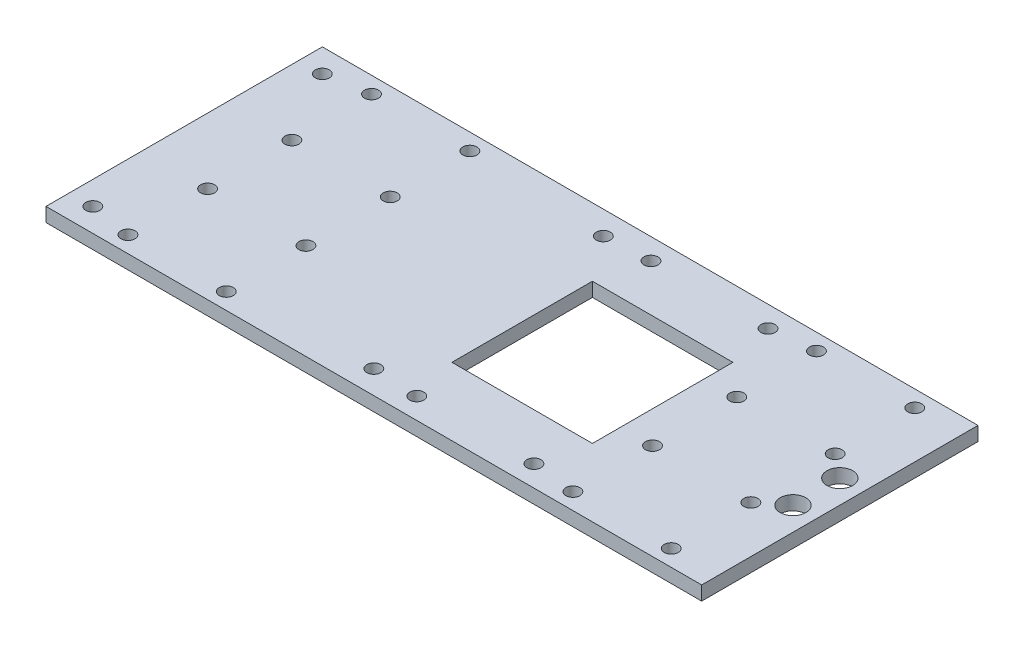
ISO-10303-21;
HEADER;
FILE_DESCRIPTION(('STEP AP214'),'2;1');
FILE_NAME('part.step','',(''),(''),'','','');
FILE_SCHEMA(('AUTOMOTIVE_DESIGN { 1 0 10303 214 1 1 1 1 }'));
ENDSEC;
DATA;
#1=APPLICATION_CONTEXT('core data for automotive mechanical design processes');
#2=APPLICATION_PROTOCOL_DEFINITION('international standard','automotive_design',2000,#1);
#3=PRODUCT_CONTEXT('',#1,'mechanical');
#4=PRODUCT('Part','Part','',(#3));
#5=PRODUCT_RELATED_PRODUCT_CATEGORY('part','',(#4));
#6=PRODUCT_DEFINITION_FORMATION('','',#4);
#7=PRODUCT_DEFINITION_CONTEXT('part definition',#1,'design');
#8=PRODUCT_DEFINITION('design','',#6,#7);
#9=PRODUCT_DEFINITION_SHAPE('','',#8);
#10=(LENGTH_UNIT() NAMED_UNIT(*) SI_UNIT(.MILLI.,.METRE.));
#11=(NAMED_UNIT(*) PLANE_ANGLE_UNIT() SI_UNIT($,.RADIAN.));
#12=(NAMED_UNIT(*) SI_UNIT($,.STERADIAN.) SOLID_ANGLE_UNIT());
#13=UNCERTAINTY_MEASURE_WITH_UNIT(LENGTH_MEASURE(1.E-05),#10,'distance_accuracy_value','');
#14=(GEOMETRIC_REPRESENTATION_CONTEXT(3) GLOBAL_UNCERTAINTY_ASSIGNED_CONTEXT((#13)) GLOBAL_UNIT_ASSIGNED_CONTEXT((#10,
#11,#12)) REPRESENTATION_CONTEXT('',''));
#15=CARTESIAN_POINT('',(0.,0.,0.));
#16=DIRECTION('',(0.,0.,1.));
#17=DIRECTION('',(1.,0.,0.));
#18=AXIS2_PLACEMENT_3D('',#15,#16,#17);
#19=CARTESIAN_POINT('',(0.,3.,0.));
#20=DIRECTION('',(0.,-1.,0.));
#21=DIRECTION('',(0.,0.,-1.));
#22=AXIS2_PLACEMENT_3D('',#19,#20,#21);
#23=PLANE('',#22);
#24=CARTESIAN_POINT('',(65.,3.,-5.));
#25=DIRECTION('',(0.,1.,0.));
#26=DIRECTION('',(0.,0.,1.));
#27=AXIS2_PLACEMENT_3D('',#24,#25,#26);
#28=CIRCLE('',#27,2.75000000000001);
#29=CARTESIAN_POINT('',(65.,3.,-2.24999999999999));
#30=VERTEX_POINT('',#29);
#31=EDGE_CURVE('E559',#30,#30,#28,.T.);
#32=ORIENTED_EDGE('',*,*,#31,.F.);
#33=EDGE_LOOP('',(#32));
#34=FACE_BOUND('',#33,.T.);
#35=CARTESIAN_POINT('',(65.,3.,5.));
#36=DIRECTION('',(0.,1.,0.));
#37=DIRECTION('',(0.,0.,1.));
#38=AXIS2_PLACEMENT_3D('',#35,#36,#37);
#39=CIRCLE('',#38,2.75000000000001);
#40=CARTESIAN_POINT('',(65.,3.,7.75000000000001));
#41=VERTEX_POINT('',#40);
#42=EDGE_CURVE('E561',#41,#41,#39,.T.);
#43=ORIENTED_EDGE('',*,*,#42,.F.);
#44=EDGE_LOOP('',(#43));
#45=FACE_BOUND('',#44,.T.);
#46=CARTESIAN_POINT('',(4.6713753918425,3.,-25.));
#47=DIRECTION('',(0.,1.,0.));
#48=DIRECTION('',(0.,0.,1.));
#49=AXIS2_PLACEMENT_3D('',#46,#47,#48);
#50=CIRCLE('',#49,1.5);
#51=CARTESIAN_POINT('',(4.6713753918425,3.,-23.5));
#52=VERTEX_POINT('',#51);
#53=EDGE_CURVE('E161',#52,#52,#50,.T.);
#54=ORIENTED_EDGE('',*,*,#53,.F.);
#55=EDGE_LOOP('',(#54));
#56=FACE_BOUND('',#55,.T.);
#57=CARTESIAN_POINT('',(4.6713753918425,3.,25.));
#58=DIRECTION('',(0.,1.,0.));
#59=DIRECTION('',(0.,0.,1.));
#60=AXIS2_PLACEMENT_3D('',#57,#58,#59);
#61=CIRCLE('',#60,1.5);
#62=CARTESIAN_POINT('',(4.6713753918425,3.,26.5));
#63=VERTEX_POINT('',#62);
#64=EDGE_CURVE('E169',#63,#63,#61,.T.);
#65=ORIENTED_EDGE('',*,*,#64,.F.);
#66=EDGE_LOOP('',(#65));
#67=FACE_BOUND('',#66,.T.);
#68=CARTESIAN_POINT('',(29.6713753918425,3.,25.));
#69=DIRECTION('',(0.,1.,0.));
#70=DIRECTION('',(0.,0.,1.));
#71=AXIS2_PLACEMENT_3D('',#68,#69,#70);
#72=CIRCLE('',#71,1.5);
#73=CARTESIAN_POINT('',(29.6713753918425,3.,26.5));
#74=VERTEX_POINT('',#73);
#75=EDGE_CURVE('E177',#74,#74,#72,.T.);
#76=ORIENTED_EDGE('',*,*,#75,.F.);
#77=EDGE_LOOP('',(#76));
#78=FACE_BOUND('',#77,.T.);
#79=CARTESIAN_POINT('',(29.6713753918425,3.,-25.));
#80=DIRECTION('',(0.,1.,0.));
#81=DIRECTION('',(0.,0.,1.));
#82=AXIS2_PLACEMENT_3D('',#79,#80,#81);
#83=CIRCLE('',#82,1.5);
#84=CARTESIAN_POINT('',(29.6713753918425,3.,-23.5));
#85=VERTEX_POINT('',#84);
#86=EDGE_CURVE('E185',#85,#85,#83,.T.);
#87=ORIENTED_EDGE('',*,*,#86,.F.);
#88=EDGE_LOOP('',(#87));
#89=FACE_BOUND('',#88,.T.);
#90=CARTESIAN_POINT('',(-65.,3.,24.5));
#91=DIRECTION('',(0.,1.,0.));
#92=DIRECTION('',(0.,0.,1.));
#93=AXIS2_PLACEMENT_3D('',#90,#91,#92);
#94=CIRCLE('',#93,1.5);
#95=CARTESIAN_POINT('',(-65.,3.,26.));
#96=VERTEX_POINT('',#95);
#97=EDGE_CURVE('E193',#96,#96,#94,.T.);
#98=ORIENTED_EDGE('',*,*,#97,.F.);
#99=EDGE_LOOP('',(#98));
#100=FACE_BOUND('',#99,.T.);
#101=CARTESIAN_POINT('',(-65.,3.,-24.5));
#102=DIRECTION('',(0.,1.,0.));
#103=DIRECTION('',(0.,0.,1.));
#104=AXIS2_PLACEMENT_3D('',#101,#102,#103);
#105=CIRCLE('',#104,1.5);
#106=CARTESIAN_POINT('',(-65.,3.,-23.));
#107=VERTEX_POINT('',#106);
#108=EDGE_CURVE('E201',#107,#107,#105,.T.);
#109=ORIENTED_EDGE('',*,*,#108,.F.);
#110=EDGE_LOOP('',(#109));
#111=FACE_BOUND('',#110,.T.);
#112=CARTESIAN_POINT('',(-5.,3.,-24.5));
#113=DIRECTION('',(0.,1.,0.));
#114=DIRECTION('',(0.,0.,1.));
#115=AXIS2_PLACEMENT_3D('',#112,#113,#114);
#116=CIRCLE('',#115,1.5);
#117=CARTESIAN_POINT('',(-5.,3.,-23.));
#118=VERTEX_POINT('',#117);
#119=EDGE_CURVE('E209',#118,#118,#116,.T.);
#120=ORIENTED_EDGE('',*,*,#119,.F.);
#121=EDGE_LOOP('',(#120));
#122=FACE_BOUND('',#121,.T.);
#123=CARTESIAN_POINT('',(-5.,3.,24.5));
#124=DIRECTION('',(0.,1.,0.));
#125=DIRECTION('',(0.,0.,1.));
#126=AXIS2_PLACEMENT_3D('',#123,#124,#125);
#127=CIRCLE('',#126,1.5);
#128=CARTESIAN_POINT('',(-5.,3.,26.));
#129=VERTEX_POINT('',#128);
#130=EDGE_CURVE('E217',#129,#129,#127,.T.);
#131=ORIENTED_EDGE('',*,*,#130,.F.);
#132=EDGE_LOOP('',(#131));
#133=FACE_BOUND('',#132,.T.);
#134=CARTESIAN_POINT('',(39.,3.,-9.));
#135=DIRECTION('',(0.,1.,0.));
#136=DIRECTION('',(0.,0.,1.));
#137=AXIS2_PLACEMENT_3D('',#134,#135,#136);
#138=CIRCLE('',#137,1.50000000000001);
#139=CARTESIAN_POINT('',(39.,3.,-7.49999999999999));
#140=VERTEX_POINT('',#139);
#141=EDGE_CURVE('E225',#140,#140,#138,.T.);
#142=ORIENTED_EDGE('',*,*,#141,.F.);
#143=EDGE_LOOP('',(#142));
#144=FACE_BOUND('',#143,.T.);
#145=CARTESIAN_POINT('',(60.,3.,-9.));
#146=DIRECTION('',(0.,1.,0.));
#147=DIRECTION('',(0.,0.,1.));
#148=AXIS2_PLACEMENT_3D('',#145,#146,#147);
#149=CIRCLE('',#148,1.5);
#150=CARTESIAN_POINT('',(60.,3.,-7.5));
#151=VERTEX_POINT('',#150);
#152=EDGE_CURVE('E233',#151,#151,#149,.T.);
#153=ORIENTED_EDGE('',*,*,#152,.F.);
#154=EDGE_LOOP('',(#153));
#155=FACE_BOUND('',#154,.T.);
#156=CARTESIAN_POINT('',(39.,3.,26.));
#157=DIRECTION('',(0.,1.,0.));
#158=DIRECTION('',(0.,0.,1.));
#159=AXIS2_PLACEMENT_3D('',#156,#157,#158);
#160=CIRCLE('',#159,1.5);
#161=CARTESIAN_POINT('',(39.,3.,27.5));
#162=VERTEX_POINT('',#161);
#163=EDGE_CURVE('E241',#162,#162,#160,.T.);
#164=ORIENTED_EDGE('',*,*,#163,.F.);
#165=EDGE_LOOP('',(#164));
#166=FACE_BOUND('',#165,.T.);
#167=CARTESIAN_POINT('',(60.,3.,26.));
#168=DIRECTION('',(0.,1.,0.));
#169=DIRECTION('',(0.,0.,1.));
#170=AXIS2_PLACEMENT_3D('',#167,#168,#169);
#171=CIRCLE('',#170,1.5);
#172=CARTESIAN_POINT('',(60.,3.,27.5));
#173=VERTEX_POINT('',#172);
#174=EDGE_CURVE('E249',#173,#173,#171,.T.);
#175=ORIENTED_EDGE('',*,*,#174,.F.);
#176=EDGE_LOOP('',(#175));
#177=FACE_BOUND('',#176,.T.);
#178=CARTESIAN_POINT('',(60.,3.,9.));
#179=DIRECTION('',(0.,1.,0.));
#180=DIRECTION('',(0.,0.,1.));
#181=AXIS2_PLACEMENT_3D('',#178,#179,#180);
#182=CIRCLE('',#181,1.5);
#183=CARTESIAN_POINT('',(60.,3.,10.5));
#184=VERTEX_POINT('',#183);
#185=EDGE_CURVE('E257',#184,#184,#182,.T.);
#186=ORIENTED_EDGE('',*,*,#185,.F.);
#187=EDGE_LOOP('',(#186));
#188=FACE_BOUND('',#187,.T.);
#189=CARTESIAN_POINT('',(39.,3.,9.));
#190=DIRECTION('',(0.,1.,0.));
#191=DIRECTION('',(0.,0.,1.));
#192=AXIS2_PLACEMENT_3D('',#189,#190,#191);
#193=CIRCLE('',#192,1.50000000000001);
#194=CARTESIAN_POINT('',(39.,3.,10.5));
#195=VERTEX_POINT('',#194);
#196=EDGE_CURVE('E265',#195,#195,#193,.T.);
#197=ORIENTED_EDGE('',*,*,#196,.F.);
#198=EDGE_LOOP('',(#197));
#199=FACE_BOUND('',#198,.T.);
#200=CARTESIAN_POINT('',(39.,3.,-26.));
#201=DIRECTION('',(0.,1.,0.));
#202=DIRECTION('',(0.,0.,1.));
#203=AXIS2_PLACEMENT_3D('',#200,#201,#202);
#204=CIRCLE('',#203,1.5);
#205=CARTESIAN_POINT('',(39.,3.,-24.5));
#206=VERTEX_POINT('',#205);
#207=EDGE_CURVE('E273',#206,#206,#204,.T.);
#208=ORIENTED_EDGE('',*,*,#207,.F.);
#209=EDGE_LOOP('',(#208));
#210=FACE_BOUND('',#209,.T.);
#211=CARTESIAN_POINT('',(60.,3.,-26.));
#212=DIRECTION('',(0.,1.,0.));
#213=DIRECTION('',(0.,0.,1.));
#214=AXIS2_PLACEMENT_3D('',#211,#212,#213);
#215=CIRCLE('',#214,1.5);
#216=CARTESIAN_POINT('',(60.,3.,-24.5));
#217=VERTEX_POINT('',#216);
#218=EDGE_CURVE('E281',#217,#217,#215,.T.);
#219=ORIENTED_EDGE('',*,*,#218,.F.);
#220=EDGE_LOOP('',(#219));
#221=FACE_BOUND('',#220,.T.);
#222=CARTESIAN_POINT('',(-56.,3.,26.));
#223=DIRECTION('',(0.,1.,0.));
#224=DIRECTION('',(0.,0.,1.));
#225=AXIS2_PLACEMENT_3D('',#222,#223,#224);
#226=CIRCLE('',#225,1.5);
#227=CARTESIAN_POINT('',(-56.,3.,27.5));
#228=VERTEX_POINT('',#227);
#229=EDGE_CURVE('E289',#228,#228,#226,.T.);
#230=ORIENTED_EDGE('',*,*,#229,.F.);
#231=EDGE_LOOP('',(#230));
#232=FACE_BOUND('',#231,.T.);
#233=CARTESIAN_POINT('',(-35.,3.,26.));
#234=DIRECTION('',(0.,1.,0.));
#235=DIRECTION('',(0.,0.,1.));
#236=AXIS2_PLACEMENT_3D('',#233,#234,#235);
#237=CIRCLE('',#236,1.5);
#238=CARTESIAN_POINT('',(-35.,3.,27.5));
#239=VERTEX_POINT('',#238);
#240=EDGE_CURVE('E297',#239,#239,#237,.T.);
#241=ORIENTED_EDGE('',*,*,#240,.F.);
#242=EDGE_LOOP('',(#241));
#243=FACE_BOUND('',#242,.T.);
#244=CARTESIAN_POINT('',(-56.,3.,9.00000000000001));
#245=DIRECTION('',(0.,1.,0.));
#246=DIRECTION('',(0.,0.,1.));
#247=AXIS2_PLACEMENT_3D('',#244,#245,#246);
#248=CIRCLE('',#247,1.5);
#249=CARTESIAN_POINT('',(-56.,3.,10.5));
#250=VERTEX_POINT('',#249);
#251=EDGE_CURVE('E305',#250,#250,#248,.T.);
#252=ORIENTED_EDGE('',*,*,#251,.F.);
#253=EDGE_LOOP('',(#252));
#254=FACE_BOUND('',#253,.T.);
#255=CARTESIAN_POINT('',(-35.,3.,9.00000000000001));
#256=DIRECTION('',(0.,1.,0.));
#257=DIRECTION('',(0.,0.,1.));
#258=AXIS2_PLACEMENT_3D('',#255,#256,#257);
#259=CIRCLE('',#258,1.5);
#260=CARTESIAN_POINT('',(-35.,3.,10.5));
#261=VERTEX_POINT('',#260);
#262=EDGE_CURVE('E313',#261,#261,#259,.T.);
#263=ORIENTED_EDGE('',*,*,#262,.F.);
#264=EDGE_LOOP('',(#263));
#265=FACE_BOUND('',#264,.T.);
#266=CARTESIAN_POINT('',(-35.,3.,-9.00000000000001));
#267=DIRECTION('',(0.,1.,0.));
#268=DIRECTION('',(0.,0.,1.));
#269=AXIS2_PLACEMENT_3D('',#266,#267,#268);
#270=CIRCLE('',#269,1.5);
#271=CARTESIAN_POINT('',(-35.,3.,-7.50000000000001));
#272=VERTEX_POINT('',#271);
#273=EDGE_CURVE('E321',#272,#272,#270,.T.);
#274=ORIENTED_EDGE('',*,*,#273,.F.);
#275=EDGE_LOOP('',(#274));
#276=FACE_BOUND('',#275,.T.);
#277=CARTESIAN_POINT('',(-56.,3.,-8.99999999999999));
#278=DIRECTION('',(0.,1.,0.));
#279=DIRECTION('',(0.,0.,1.));
#280=AXIS2_PLACEMENT_3D('',#277,#278,#279);
#281=CIRCLE('',#280,1.5);
#282=CARTESIAN_POINT('',(-56.,3.,-7.49999999999999));
#283=VERTEX_POINT('',#282);
#284=EDGE_CURVE('E329',#283,#283,#281,.T.);
#285=ORIENTED_EDGE('',*,*,#284,.F.);
#286=EDGE_LOOP('',(#285));
#287=FACE_BOUND('',#286,.T.);
#288=CARTESIAN_POINT('',(-56.,3.,-26.));
#289=DIRECTION('',(0.,1.,0.));
#290=DIRECTION('',(0.,0.,1.));
#291=AXIS2_PLACEMENT_3D('',#288,#289,#290);
#292=CIRCLE('',#291,1.5);
#293=CARTESIAN_POINT('',(-56.,3.,-24.5));
#294=VERTEX_POINT('',#293);
#295=EDGE_CURVE('E337',#294,#294,#292,.T.);
#296=ORIENTED_EDGE('',*,*,#295,.F.);
#297=EDGE_LOOP('',(#296));
#298=FACE_BOUND('',#297,.T.);
#299=CARTESIAN_POINT('',(-35.,3.,-26.));
#300=DIRECTION('',(0.,1.,0.));
#301=DIRECTION('',(0.,0.,1.));
#302=AXIS2_PLACEMENT_3D('',#299,#300,#301);
#303=CIRCLE('',#302,1.5);
#304=CARTESIAN_POINT('',(-35.,3.,-24.5));
#305=VERTEX_POINT('',#304);
#306=EDGE_CURVE('E345',#305,#305,#303,.T.);
#307=ORIENTED_EDGE('',*,*,#306,.F.);
#308=EDGE_LOOP('',(#307));
#309=FACE_BOUND('',#308,.T.);
#310=DIRECTION('',(0.,0.,-1.));
#311=VECTOR('',#310,1.);
#312=CARTESIAN_POINT('',(70.,3.,29.5));
#313=LINE('',#312,#311);
#314=CARTESIAN_POINT('',(70.,3.,29.5));
#315=VERTEX_POINT('',#314);
#316=CARTESIAN_POINT('',(70.,3.,-29.5));
#317=VERTEX_POINT('',#316);
#318=EDGE_CURVE('E353',#315,#317,#313,.T.);
#319=ORIENTED_EDGE('',*,*,#318,.T.);
#320=DIRECTION('',(-1.,0.,0.));
#321=VECTOR('',#320,1.);
#322=CARTESIAN_POINT('',(-70.,3.,-29.5));
#323=LINE('',#322,#321);
#324=CARTESIAN_POINT('',(-70.,3.,-29.5));
#325=VERTEX_POINT('',#324);
#326=EDGE_CURVE('E357',#317,#325,#323,.T.);
#327=ORIENTED_EDGE('',*,*,#326,.T.);
#328=DIRECTION('',(0.,0.,1.));
#329=VECTOR('',#328,1.);
#330=CARTESIAN_POINT('',(-70.,3.,29.5));
#331=LINE('',#330,#329);
#332=CARTESIAN_POINT('',(-70.,3.,29.5));
#333=VERTEX_POINT('',#332);
#334=EDGE_CURVE('E361',#325,#333,#331,.T.);
#335=ORIENTED_EDGE('',*,*,#334,.T.);
#336=DIRECTION('',(1.,0.,0.));
#337=VECTOR('',#336,1.);
#338=CARTESIAN_POINT('',(-70.,3.,29.5));
#339=LINE('',#338,#337);
#340=EDGE_CURVE('E364',#333,#315,#339,.T.);
#341=ORIENTED_EDGE('',*,*,#340,.T.);
#342=EDGE_LOOP('',(#319,#327,#335,#341));
#343=FACE_BOUND('',#342,.T.);
#344=DIRECTION('',(0.,0.,-1.));
#345=VECTOR('',#344,1.);
#346=CARTESIAN_POINT('',(32.1713753918425,3.,15.));
#347=LINE('',#346,#345);
#348=CARTESIAN_POINT('',(32.1713753918425,3.,15.));
#349=VERTEX_POINT('',#348);
#350=CARTESIAN_POINT('',(32.1713753918425,3.,-15.));
#351=VERTEX_POINT('',#350);
#352=EDGE_CURVE('E111',#349,#351,#347,.T.);
#353=ORIENTED_EDGE('',*,*,#352,.F.);
#354=DIRECTION('',(1.,0.,0.));
#355=VECTOR('',#354,1.);
#356=CARTESIAN_POINT('',(2.1713753918425,3.,15.));
#357=LINE('',#356,#355);
#358=CARTESIAN_POINT('',(2.1713753918425,3.,15.));
#359=VERTEX_POINT('',#358);
#360=EDGE_CURVE('E137',#359,#349,#357,.T.);
#361=ORIENTED_EDGE('',*,*,#360,.F.);
#362=DIRECTION('',(0.,0.,1.));
#363=VECTOR('',#362,1.);
#364=CARTESIAN_POINT('',(2.1713753918425,3.,15.));
#365=LINE('',#364,#363);
#366=CARTESIAN_POINT('',(2.1713753918425,3.,-15.));
#367=VERTEX_POINT('',#366);
#368=EDGE_CURVE('E133',#367,#359,#365,.T.);
#369=ORIENTED_EDGE('',*,*,#368,.F.);
#370=DIRECTION('',(-1.,0.,0.));
#371=VECTOR('',#370,1.);
#372=CARTESIAN_POINT('',(2.1713753918425,3.,-15.));
#373=LINE('',#372,#371);
#374=EDGE_CURVE('E120',#351,#367,#373,.T.);
#375=ORIENTED_EDGE('',*,*,#374,.F.);
#376=EDGE_LOOP('',(#353,#361,#369,#375));
#377=FACE_BOUND('',#376,.T.);
#378=ADVANCED_FACE('F45',(#34,#45,#56,#67,#78,#89,#100,#111,#122,#133,#144,#155,#166,#177,#188,
#199,#210,#221,#232,#243,#254,#265,#276,#287,#298,#309,#343,#377),#23,.F.);
#379=CARTESIAN_POINT('',(0.,0.,0.));
#380=DIRECTION('',(0.,-1.,0.));
#381=DIRECTION('',(0.,0.,-1.));
#382=AXIS2_PLACEMENT_3D('',#379,#380,#381);
#383=PLANE('',#382);
#384=CARTESIAN_POINT('',(65.,0.,-5.));
#385=DIRECTION('',(0.,1.,0.));
#386=DIRECTION('',(0.,0.,1.));
#387=AXIS2_PLACEMENT_3D('',#384,#385,#386);
#388=CIRCLE('',#387,2.75000000000001);
#389=CARTESIAN_POINT('',(65.,0.,-2.24999999999999));
#390=VERTEX_POINT('',#389);
#391=EDGE_CURVE('E145',#390,#390,#388,.T.);
#392=ORIENTED_EDGE('',*,*,#391,.T.);
#393=EDGE_LOOP('',(#392));
#394=FACE_BOUND('',#393,.T.);
#395=CARTESIAN_POINT('',(65.,0.,5.));
#396=DIRECTION('',(0.,1.,0.));
#397=DIRECTION('',(0.,0.,1.));
#398=AXIS2_PLACEMENT_3D('',#395,#396,#397);
#399=CIRCLE('',#398,2.75000000000001);
#400=CARTESIAN_POINT('',(65.,0.,7.75000000000001));
#401=VERTEX_POINT('',#400);
#402=EDGE_CURVE('E567',#401,#401,#399,.T.);
#403=ORIENTED_EDGE('',*,*,#402,.T.);
#404=EDGE_LOOP('',(#403));
#405=FACE_BOUND('',#404,.T.);
#406=CARTESIAN_POINT('',(4.6713753918425,0.,25.));
#407=DIRECTION('',(0.,1.,0.));
#408=DIRECTION('',(0.,0.,1.));
#409=AXIS2_PLACEMENT_3D('',#406,#407,#408);
#410=CIRCLE('',#409,1.5);
#411=CARTESIAN_POINT('',(4.6713753918425,0.,26.5));
#412=VERTEX_POINT('',#411);
#413=EDGE_CURVE('E165',#412,#412,#410,.T.);
#414=ORIENTED_EDGE('',*,*,#413,.T.);
#415=EDGE_LOOP('',(#414));
#416=FACE_BOUND('',#415,.T.);
#417=CARTESIAN_POINT('',(29.6713753918425,0.,-25.));
#418=DIRECTION('',(0.,1.,0.));
#419=DIRECTION('',(0.,0.,1.));
#420=AXIS2_PLACEMENT_3D('',#417,#418,#419);
#421=CIRCLE('',#420,1.5);
#422=CARTESIAN_POINT('',(29.6713753918425,0.,-23.5));
#423=VERTEX_POINT('',#422);
#424=EDGE_CURVE('E181',#423,#423,#421,.T.);
#425=ORIENTED_EDGE('',*,*,#424,.T.);
#426=EDGE_LOOP('',(#425));
#427=FACE_BOUND('',#426,.T.);
#428=CARTESIAN_POINT('',(-65.,0.,-24.5));
#429=DIRECTION('',(0.,1.,0.));
#430=DIRECTION('',(0.,0.,1.));
#431=AXIS2_PLACEMENT_3D('',#428,#429,#430);
#432=CIRCLE('',#431,1.5);
#433=CARTESIAN_POINT('',(-65.,0.,-23.));
#434=VERTEX_POINT('',#433);
#435=EDGE_CURVE('E197',#434,#434,#432,.T.);
#436=ORIENTED_EDGE('',*,*,#435,.T.);
#437=EDGE_LOOP('',(#436));
#438=FACE_BOUND('',#437,.T.);
#439=CARTESIAN_POINT('',(-5.,0.,24.5));
#440=DIRECTION('',(0.,1.,0.));
#441=DIRECTION('',(0.,0.,1.));
#442=AXIS2_PLACEMENT_3D('',#439,#440,#441);
#443=CIRCLE('',#442,1.5);
#444=CARTESIAN_POINT('',(-5.,0.,26.));
#445=VERTEX_POINT('',#444);
#446=EDGE_CURVE('E213',#445,#445,#443,.T.);
#447=ORIENTED_EDGE('',*,*,#446,.T.);
#448=EDGE_LOOP('',(#447));
#449=FACE_BOUND('',#448,.T.);
#450=CARTESIAN_POINT('',(60.,0.,-9.));
#451=DIRECTION('',(0.,1.,0.));
#452=DIRECTION('',(0.,0.,1.));
#453=AXIS2_PLACEMENT_3D('',#450,#451,#452);
#454=CIRCLE('',#453,1.5);
#455=CARTESIAN_POINT('',(60.,0.,-7.5));
#456=VERTEX_POINT('',#455);
#457=EDGE_CURVE('E229',#456,#456,#454,.T.);
#458=ORIENTED_EDGE('',*,*,#457,.T.);
#459=EDGE_LOOP('',(#458));
#460=FACE_BOUND('',#459,.T.);
#461=CARTESIAN_POINT('',(60.,0.,26.));
#462=DIRECTION('',(0.,1.,0.));
#463=DIRECTION('',(0.,0.,1.));
#464=AXIS2_PLACEMENT_3D('',#461,#462,#463);
#465=CIRCLE('',#464,1.5);
#466=CARTESIAN_POINT('',(60.,0.,27.5));
#467=VERTEX_POINT('',#466);
#468=EDGE_CURVE('E245',#467,#467,#465,.T.);
#469=ORIENTED_EDGE('',*,*,#468,.T.);
#470=EDGE_LOOP('',(#469));
#471=FACE_BOUND('',#470,.T.);
#472=CARTESIAN_POINT('',(39.,0.,9.));
#473=DIRECTION('',(0.,1.,0.));
#474=DIRECTION('',(0.,0.,1.));
#475=AXIS2_PLACEMENT_3D('',#472,#473,#474);
#476=CIRCLE('',#475,1.50000000000001);
#477=CARTESIAN_POINT('',(39.,0.,10.5));
#478=VERTEX_POINT('',#477);
#479=EDGE_CURVE('E261',#478,#478,#476,.T.);
#480=ORIENTED_EDGE('',*,*,#479,.T.);
#481=EDGE_LOOP('',(#480));
#482=FACE_BOUND('',#481,.T.);
#483=CARTESIAN_POINT('',(60.,0.,-26.));
#484=DIRECTION('',(0.,1.,0.));
#485=DIRECTION('',(0.,0.,1.));
#486=AXIS2_PLACEMENT_3D('',#483,#484,#485);
#487=CIRCLE('',#486,1.5);
#488=CARTESIAN_POINT('',(60.,0.,-24.5));
#489=VERTEX_POINT('',#488);
#490=EDGE_CURVE('E277',#489,#489,#487,.T.);
#491=ORIENTED_EDGE('',*,*,#490,.T.);
#492=EDGE_LOOP('',(#491));
#493=FACE_BOUND('',#492,.T.);
#494=CARTESIAN_POINT('',(-35.,0.,26.));
#495=DIRECTION('',(0.,1.,0.));
#496=DIRECTION('',(0.,0.,1.));
#497=AXIS2_PLACEMENT_3D('',#494,#495,#496);
#498=CIRCLE('',#497,1.5);
#499=CARTESIAN_POINT('',(-35.,0.,27.5));
#500=VERTEX_POINT('',#499);
#501=EDGE_CURVE('E293',#500,#500,#498,.T.);
#502=ORIENTED_EDGE('',*,*,#501,.T.);
#503=EDGE_LOOP('',(#502));
#504=FACE_BOUND('',#503,.T.);
#505=CARTESIAN_POINT('',(-35.,0.,9.00000000000001));
#506=DIRECTION('',(0.,1.,0.));
#507=DIRECTION('',(0.,0.,1.));
#508=AXIS2_PLACEMENT_3D('',#505,#506,#507);
#509=CIRCLE('',#508,1.5);
#510=CARTESIAN_POINT('',(-35.,0.,10.5));
#511=VERTEX_POINT('',#510);
#512=EDGE_CURVE('E309',#511,#511,#509,.T.);
#513=ORIENTED_EDGE('',*,*,#512,.T.);
#514=EDGE_LOOP('',(#513));
#515=FACE_BOUND('',#514,.T.);
#516=CARTESIAN_POINT('',(-56.,0.,-8.99999999999999));
#517=DIRECTION('',(0.,1.,0.));
#518=DIRECTION('',(0.,0.,1.));
#519=AXIS2_PLACEMENT_3D('',#516,#517,#518);
#520=CIRCLE('',#519,1.5);
#521=CARTESIAN_POINT('',(-56.,0.,-7.49999999999999));
#522=VERTEX_POINT('',#521);
#523=EDGE_CURVE('E325',#522,#522,#520,.T.);
#524=ORIENTED_EDGE('',*,*,#523,.T.);
#525=EDGE_LOOP('',(#524));
#526=FACE_BOUND('',#525,.T.);
#527=CARTESIAN_POINT('',(-35.,0.,-26.));
#528=DIRECTION('',(0.,1.,0.));
#529=DIRECTION('',(0.,0.,1.));
#530=AXIS2_PLACEMENT_3D('',#527,#528,#529);
#531=CIRCLE('',#530,1.5);
#532=CARTESIAN_POINT('',(-35.,0.,-24.5));
#533=VERTEX_POINT('',#532);
#534=EDGE_CURVE('E341',#533,#533,#531,.T.);
#535=ORIENTED_EDGE('',*,*,#534,.T.);
#536=EDGE_LOOP('',(#535));
#537=FACE_BOUND('',#536,.T.);
#538=DIRECTION('',(0.,0.,-1.));
#539=VECTOR('',#538,1.);
#540=CARTESIAN_POINT('',(70.,0.,29.5));
#541=LINE('',#540,#539);
#542=CARTESIAN_POINT('',(70.,0.,29.5));
#543=VERTEX_POINT('',#542);
#544=CARTESIAN_POINT('',(70.,0.,-29.5));
#545=VERTEX_POINT('',#544);
#546=EDGE_CURVE('E349',#543,#545,#541,.T.);
#547=ORIENTED_EDGE('',*,*,#546,.F.);
#548=DIRECTION('',(1.,0.,0.));
#549=VECTOR('',#548,1.);
#550=CARTESIAN_POINT('',(-70.,0.,29.5));
#551=LINE('',#550,#549);
#552=CARTESIAN_POINT('',(-70.,0.,29.5));
#553=VERTEX_POINT('',#552);
#554=EDGE_CURVE('E358',#553,#543,#551,.T.);
#555=ORIENTED_EDGE('',*,*,#554,.F.);
#556=DIRECTION('',(0.,0.,1.));
#557=VECTOR('',#556,1.);
#558=CARTESIAN_POINT('',(-70.,0.,29.5));
#559=LINE('',#558,#557);
#560=CARTESIAN_POINT('',(-70.,0.,-29.5));
#561=VERTEX_POINT('',#560);
#562=EDGE_CURVE('E374',#561,#553,#559,.T.);
#563=ORIENTED_EDGE('',*,*,#562,.F.);
#564=DIRECTION('',(-1.,0.,0.));
#565=VECTOR('',#564,1.);
#566=CARTESIAN_POINT('',(-70.,0.,-29.5));
#567=LINE('',#566,#565);
#568=EDGE_CURVE('E371',#545,#561,#567,.T.);
#569=ORIENTED_EDGE('',*,*,#568,.F.);
#570=EDGE_LOOP('',(#547,#555,#563,#569));
#571=FACE_BOUND('',#570,.T.);
#572=CARTESIAN_POINT('',(-56.,0.,-26.));
#573=DIRECTION('',(0.,1.,0.));
#574=DIRECTION('',(0.,0.,1.));
#575=AXIS2_PLACEMENT_3D('',#572,#573,#574);
#576=CIRCLE('',#575,1.5);
#577=CARTESIAN_POINT('',(-56.,0.,-24.5));
#578=VERTEX_POINT('',#577);
#579=EDGE_CURVE('E333',#578,#578,#576,.T.);
#580=ORIENTED_EDGE('',*,*,#579,.T.);
#581=EDGE_LOOP('',(#580));
#582=FACE_BOUND('',#581,.T.);
#583=CARTESIAN_POINT('',(-35.,0.,-9.00000000000001));
#584=DIRECTION('',(0.,1.,0.));
#585=DIRECTION('',(0.,0.,1.));
#586=AXIS2_PLACEMENT_3D('',#583,#584,#585);
#587=CIRCLE('',#586,1.5);
#588=CARTESIAN_POINT('',(-35.,0.,-7.50000000000001));
#589=VERTEX_POINT('',#588);
#590=EDGE_CURVE('E317',#589,#589,#587,.T.);
#591=ORIENTED_EDGE('',*,*,#590,.T.);
#592=EDGE_LOOP('',(#591));
#593=FACE_BOUND('',#592,.T.);
#594=CARTESIAN_POINT('',(-56.,0.,9.00000000000001));
#595=DIRECTION('',(0.,1.,0.));
#596=DIRECTION('',(0.,0.,1.));
#597=AXIS2_PLACEMENT_3D('',#594,#595,#596);
#598=CIRCLE('',#597,1.5);
#599=CARTESIAN_POINT('',(-56.,0.,10.5));
#600=VERTEX_POINT('',#599);
#601=EDGE_CURVE('E301',#600,#600,#598,.T.);
#602=ORIENTED_EDGE('',*,*,#601,.T.);
#603=EDGE_LOOP('',(#602));
#604=FACE_BOUND('',#603,.T.);
#605=CARTESIAN_POINT('',(-56.,0.,26.));
#606=DIRECTION('',(0.,1.,0.));
#607=DIRECTION('',(0.,0.,1.));
#608=AXIS2_PLACEMENT_3D('',#605,#606,#607);
#609=CIRCLE('',#608,1.5);
#610=CARTESIAN_POINT('',(-56.,0.,27.5));
#611=VERTEX_POINT('',#610);
#612=EDGE_CURVE('E285',#611,#611,#609,.T.);
#613=ORIENTED_EDGE('',*,*,#612,.T.);
#614=EDGE_LOOP('',(#613));
#615=FACE_BOUND('',#614,.T.);
#616=CARTESIAN_POINT('',(39.,0.,-26.));
#617=DIRECTION('',(0.,1.,0.));
#618=DIRECTION('',(0.,0.,1.));
#619=AXIS2_PLACEMENT_3D('',#616,#617,#618);
#620=CIRCLE('',#619,1.5);
#621=CARTESIAN_POINT('',(39.,0.,-24.5));
#622=VERTEX_POINT('',#621);
#623=EDGE_CURVE('E269',#622,#622,#620,.T.);
#624=ORIENTED_EDGE('',*,*,#623,.T.);
#625=EDGE_LOOP('',(#624));
#626=FACE_BOUND('',#625,.T.);
#627=CARTESIAN_POINT('',(60.,0.,9.));
#628=DIRECTION('',(0.,1.,0.));
#629=DIRECTION('',(0.,0.,1.));
#630=AXIS2_PLACEMENT_3D('',#627,#628,#629);
#631=CIRCLE('',#630,1.5);
#632=CARTESIAN_POINT('',(60.,0.,10.5));
#633=VERTEX_POINT('',#632);
#634=EDGE_CURVE('E253',#633,#633,#631,.T.);
#635=ORIENTED_EDGE('',*,*,#634,.T.);
#636=EDGE_LOOP('',(#635));
#637=FACE_BOUND('',#636,.T.);
#638=CARTESIAN_POINT('',(39.,0.,26.));
#639=DIRECTION('',(0.,1.,0.));
#640=DIRECTION('',(0.,0.,1.));
#641=AXIS2_PLACEMENT_3D('',#638,#639,#640);
#642=CIRCLE('',#641,1.5);
#643=CARTESIAN_POINT('',(39.,0.,27.5));
#644=VERTEX_POINT('',#643);
#645=EDGE_CURVE('E237',#644,#644,#642,.T.);
#646=ORIENTED_EDGE('',*,*,#645,.T.);
#647=EDGE_LOOP('',(#646));
#648=FACE_BOUND('',#647,.T.);
#649=CARTESIAN_POINT('',(39.,0.,-9.));
#650=DIRECTION('',(0.,1.,0.));
#651=DIRECTION('',(0.,0.,1.));
#652=AXIS2_PLACEMENT_3D('',#649,#650,#651);
#653=CIRCLE('',#652,1.50000000000001);
#654=CARTESIAN_POINT('',(39.,0.,-7.49999999999999));
#655=VERTEX_POINT('',#654);
#656=EDGE_CURVE('E221',#655,#655,#653,.T.);
#657=ORIENTED_EDGE('',*,*,#656,.T.);
#658=EDGE_LOOP('',(#657));
#659=FACE_BOUND('',#658,.T.);
#660=CARTESIAN_POINT('',(-5.,0.,-24.5));
#661=DIRECTION('',(0.,1.,0.));
#662=DIRECTION('',(0.,0.,1.));
#663=AXIS2_PLACEMENT_3D('',#660,#661,#662);
#664=CIRCLE('',#663,1.5);
#665=CARTESIAN_POINT('',(-5.,0.,-23.));
#666=VERTEX_POINT('',#665);
#667=EDGE_CURVE('E205',#666,#666,#664,.T.);
#668=ORIENTED_EDGE('',*,*,#667,.T.);
#669=EDGE_LOOP('',(#668));
#670=FACE_BOUND('',#669,.T.);
#671=CARTESIAN_POINT('',(-65.,0.,24.5));
#672=DIRECTION('',(0.,1.,0.));
#673=DIRECTION('',(0.,0.,1.));
#674=AXIS2_PLACEMENT_3D('',#671,#672,#673);
#675=CIRCLE('',#674,1.5);
#676=CARTESIAN_POINT('',(-65.,0.,26.));
#677=VERTEX_POINT('',#676);
#678=EDGE_CURVE('E189',#677,#677,#675,.T.);
#679=ORIENTED_EDGE('',*,*,#678,.T.);
#680=EDGE_LOOP('',(#679));
#681=FACE_BOUND('',#680,.T.);
#682=CARTESIAN_POINT('',(29.6713753918425,0.,25.));
#683=DIRECTION('',(0.,1.,0.));
#684=DIRECTION('',(0.,0.,1.));
#685=AXIS2_PLACEMENT_3D('',#682,#683,#684);
#686=CIRCLE('',#685,1.5);
#687=CARTESIAN_POINT('',(29.6713753918425,0.,26.5));
#688=VERTEX_POINT('',#687);
#689=EDGE_CURVE('E173',#688,#688,#686,.T.);
#690=ORIENTED_EDGE('',*,*,#689,.T.);
#691=EDGE_LOOP('',(#690));
#692=FACE_BOUND('',#691,.T.);
#693=CARTESIAN_POINT('',(4.6713753918425,0.,-25.));
#694=DIRECTION('',(0.,1.,0.));
#695=DIRECTION('',(0.,0.,1.));
#696=AXIS2_PLACEMENT_3D('',#693,#694,#695);
#697=CIRCLE('',#696,1.5);
#698=CARTESIAN_POINT('',(4.6713753918425,0.,-23.5));
#699=VERTEX_POINT('',#698);
#700=EDGE_CURVE('E129',#699,#699,#697,.T.);
#701=ORIENTED_EDGE('',*,*,#700,.T.);
#702=EDGE_LOOP('',(#701));
#703=FACE_BOUND('',#702,.T.);
#704=DIRECTION('',(1.,0.,0.));
#705=VECTOR('',#704,1.);
#706=CARTESIAN_POINT('',(2.1713753918425,0.,15.));
#707=LINE('',#706,#705);
#708=CARTESIAN_POINT('',(2.1713753918425,0.,15.));
#709=VERTEX_POINT('',#708);
#710=CARTESIAN_POINT('',(32.1713753918425,0.,15.));
#711=VERTEX_POINT('',#710);
#712=EDGE_CURVE('E121',#709,#711,#707,.T.);
#713=ORIENTED_EDGE('',*,*,#712,.T.);
#714=DIRECTION('',(0.,0.,-1.));
#715=VECTOR('',#714,1.);
#716=CARTESIAN_POINT('',(32.1713753918425,0.,15.));
#717=LINE('',#716,#715);
#718=CARTESIAN_POINT('',(32.1713753918425,0.,-15.));
#719=VERTEX_POINT('',#718);
#720=EDGE_CURVE('E69',#711,#719,#717,.T.);
#721=ORIENTED_EDGE('',*,*,#720,.T.);
#722=DIRECTION('',(-1.,0.,0.));
#723=VECTOR('',#722,1.);
#724=CARTESIAN_POINT('',(2.1713753918425,0.,-15.));
#725=LINE('',#724,#723);
#726=CARTESIAN_POINT('',(2.1713753918425,0.,-15.));
#727=VERTEX_POINT('',#726);
#728=EDGE_CURVE('E127',#719,#727,#725,.T.);
#729=ORIENTED_EDGE('',*,*,#728,.T.);
#730=DIRECTION('',(0.,0.,1.));
#731=VECTOR('',#730,1.);
#732=CARTESIAN_POINT('',(2.1713753918425,0.,15.));
#733=LINE('',#732,#731);
#734=EDGE_CURVE('E148',#727,#709,#733,.T.);
#735=ORIENTED_EDGE('',*,*,#734,.T.);
#736=EDGE_LOOP('',(#713,#721,#729,#735));
#737=FACE_BOUND('',#736,.T.);
#738=ADVANCED_FACE('F397',(#394,#405,#416,#427,#438,#449,#460,#471,#482,#493,#504,#515,#526,
#537,#571,#582,#593,#604,#615,#626,#637,#648,#659,#670,#681,#692,#703,#737),#383,.T.);
#739=CARTESIAN_POINT('',(70.,3.,29.5));
#740=DIRECTION('',(-1.,0.,0.));
#741=DIRECTION('',(0.,0.,1.));
#742=AXIS2_PLACEMENT_3D('',#739,#740,#741);
#743=PLANE('',#742);
#744=ORIENTED_EDGE('',*,*,#546,.T.);
#745=DIRECTION('',(0.,-1.,0.));
#746=VECTOR('',#745,1.);
#747=CARTESIAN_POINT('',(70.,3.,-29.5));
#748=LINE('',#747,#746);
#749=EDGE_CURVE('E11',#317,#545,#748,.T.);
#750=ORIENTED_EDGE('',*,*,#749,.F.);
#751=ORIENTED_EDGE('',*,*,#318,.F.);
#752=DIRECTION('',(0.,-1.,0.));
#753=VECTOR('',#752,1.);
#754=CARTESIAN_POINT('',(70.,3.,29.5));
#755=LINE('',#754,#753);
#756=EDGE_CURVE('E367',#315,#543,#755,.T.);
#757=ORIENTED_EDGE('',*,*,#756,.T.);
#758=EDGE_LOOP('',(#744,#750,#751,#757));
#759=FACE_BOUND('',#758,.T.);
#760=ADVANCED_FACE('F47',(#759),#743,.F.);
#761=CARTESIAN_POINT('',(-70.,3.,-29.5));
#762=DIRECTION('',(0.,0.,1.));
#763=DIRECTION('',(1.,0.,0.));
#764=AXIS2_PLACEMENT_3D('',#761,#762,#763);
#765=PLANE('',#764);
#766=ORIENTED_EDGE('',*,*,#568,.T.);
#767=DIRECTION('',(0.,-1.,0.));
#768=VECTOR('',#767,1.);
#769=CARTESIAN_POINT('',(-70.,3.,-29.5));
#770=LINE('',#769,#768);
#771=EDGE_CURVE('E54',#325,#561,#770,.T.);
#772=ORIENTED_EDGE('',*,*,#771,.F.);
#773=ORIENTED_EDGE('',*,*,#326,.F.);
#774=ORIENTED_EDGE('',*,*,#749,.T.);
#775=EDGE_LOOP('',(#766,#772,#773,#774));
#776=FACE_BOUND('',#775,.T.);
#777=ADVANCED_FACE('F407',(#776),#765,.F.);
#778=CARTESIAN_POINT('',(-70.,3.,29.5));
#779=DIRECTION('',(1.,0.,0.));
#780=DIRECTION('',(0.,0.,-1.));
#781=AXIS2_PLACEMENT_3D('',#778,#779,#780);
#782=PLANE('',#781);
#783=ORIENTED_EDGE('',*,*,#562,.T.);
#784=DIRECTION('',(0.,-1.,0.));
#785=VECTOR('',#784,1.);
#786=CARTESIAN_POINT('',(-70.,3.,29.5));
#787=LINE('',#786,#785);
#788=EDGE_CURVE('E382',#333,#553,#787,.T.);
#789=ORIENTED_EDGE('',*,*,#788,.F.);
#790=ORIENTED_EDGE('',*,*,#334,.F.);
#791=ORIENTED_EDGE('',*,*,#771,.T.);
#792=EDGE_LOOP('',(#783,#789,#790,#791));
#793=FACE_BOUND('',#792,.T.);
#794=ADVANCED_FACE('F391',(#793),#782,.F.);
#795=CARTESIAN_POINT('',(-70.,3.,29.5));
#796=DIRECTION('',(0.,0.,-1.));
#797=DIRECTION('',(-1.,0.,0.));
#798=AXIS2_PLACEMENT_3D('',#795,#796,#797);
#799=PLANE('',#798);
#800=ORIENTED_EDGE('',*,*,#554,.T.);
#801=ORIENTED_EDGE('',*,*,#756,.F.);
#802=ORIENTED_EDGE('',*,*,#340,.F.);
#803=ORIENTED_EDGE('',*,*,#788,.T.);
#804=EDGE_LOOP('',(#800,#801,#802,#803));
#805=FACE_BOUND('',#804,.T.);
#806=ADVANCED_FACE('F401',(#805),#799,.F.);
#807=CARTESIAN_POINT('',(-35.,3.,-26.));
#808=DIRECTION('',(0.,-1.,0.));
#809=DIRECTION('',(0.,0.,-1.));
#810=AXIS2_PLACEMENT_3D('',#807,#808,#809);
#811=CYLINDRICAL_SURFACE('',#810,1.5);
#812=ORIENTED_EDGE('',*,*,#306,.T.);
#813=EDGE_LOOP('',(#812));
#814=FACE_BOUND('',#813,.T.);
#815=ORIENTED_EDGE('',*,*,#534,.F.);
#816=EDGE_LOOP('',(#815));
#817=FACE_BOUND('',#816,.T.);
#818=ADVANCED_FACE('F425',(#814,#817),#811,.F.);
#819=CARTESIAN_POINT('',(-56.,3.,-26.));
#820=DIRECTION('',(0.,-1.,0.));
#821=DIRECTION('',(0.,0.,-1.));
#822=AXIS2_PLACEMENT_3D('',#819,#820,#821);
#823=CYLINDRICAL_SURFACE('',#822,1.5);
#824=ORIENTED_EDGE('',*,*,#295,.T.);
#825=EDGE_LOOP('',(#824));
#826=FACE_BOUND('',#825,.T.);
#827=ORIENTED_EDGE('',*,*,#579,.F.);
#828=EDGE_LOOP('',(#827));
#829=FACE_BOUND('',#828,.T.);
#830=ADVANCED_FACE('F432',(#826,#829),#823,.F.);
#831=CARTESIAN_POINT('',(-56.,3.,-8.99999999999999));
#832=DIRECTION('',(0.,-1.,0.));
#833=DIRECTION('',(0.,0.,-1.));
#834=AXIS2_PLACEMENT_3D('',#831,#832,#833);
#835=CYLINDRICAL_SURFACE('',#834,1.5);
#836=ORIENTED_EDGE('',*,*,#284,.T.);
#837=EDGE_LOOP('',(#836));
#838=FACE_BOUND('',#837,.T.);
#839=ORIENTED_EDGE('',*,*,#523,.F.);
#840=EDGE_LOOP('',(#839));
#841=FACE_BOUND('',#840,.T.);
#842=ADVANCED_FACE('F437',(#838,#841),#835,.F.);
#843=CARTESIAN_POINT('',(-35.,3.,-9.00000000000001));
#844=DIRECTION('',(0.,-1.,0.));
#845=DIRECTION('',(0.,0.,-1.));
#846=AXIS2_PLACEMENT_3D('',#843,#844,#845);
#847=CYLINDRICAL_SURFACE('',#846,1.5);
#848=ORIENTED_EDGE('',*,*,#273,.T.);
#849=EDGE_LOOP('',(#848));
#850=FACE_BOUND('',#849,.T.);
#851=ORIENTED_EDGE('',*,*,#590,.F.);
#852=EDGE_LOOP('',(#851));
#853=FACE_BOUND('',#852,.T.);
#854=ADVANCED_FACE('F447',(#850,#853),#847,.F.);
#855=CARTESIAN_POINT('',(-35.,3.,9.00000000000001));
#856=DIRECTION('',(0.,-1.,0.));
#857=DIRECTION('',(0.,0.,-1.));
#858=AXIS2_PLACEMENT_3D('',#855,#856,#857);
#859=CYLINDRICAL_SURFACE('',#858,1.5);
#860=ORIENTED_EDGE('',*,*,#262,.T.);
#861=EDGE_LOOP('',(#860));
#862=FACE_BOUND('',#861,.T.);
#863=ORIENTED_EDGE('',*,*,#512,.F.);
#864=EDGE_LOOP('',(#863));
#865=FACE_BOUND('',#864,.T.);
#866=ADVANCED_FACE('F454',(#862,#865),#859,.F.);
#867=CARTESIAN_POINT('',(-56.,3.,9.00000000000001));
#868=DIRECTION('',(0.,-1.,0.));
#869=DIRECTION('',(0.,0.,-1.));
#870=AXIS2_PLACEMENT_3D('',#867,#868,#869);
#871=CYLINDRICAL_SURFACE('',#870,1.5);
#872=ORIENTED_EDGE('',*,*,#251,.T.);
#873=EDGE_LOOP('',(#872));
#874=FACE_BOUND('',#873,.T.);
#875=ORIENTED_EDGE('',*,*,#601,.F.);
#876=EDGE_LOOP('',(#875));
#877=FACE_BOUND('',#876,.T.);
#878=ADVANCED_FACE('F458',(#874,#877),#871,.F.);
#879=CARTESIAN_POINT('',(-35.,3.,26.));
#880=DIRECTION('',(0.,-1.,0.));
#881=DIRECTION('',(0.,0.,-1.));
#882=AXIS2_PLACEMENT_3D('',#879,#880,#881);
#883=CYLINDRICAL_SURFACE('',#882,1.5);
#884=ORIENTED_EDGE('',*,*,#240,.T.);
#885=EDGE_LOOP('',(#884));
#886=FACE_BOUND('',#885,.T.);
#887=ORIENTED_EDGE('',*,*,#501,.F.);
#888=EDGE_LOOP('',(#887));
#889=FACE_BOUND('',#888,.T.);
#890=ADVANCED_FACE('F462',(#886,#889),#883,.F.);
#891=CARTESIAN_POINT('',(-56.,3.,26.));
#892=DIRECTION('',(0.,-1.,0.));
#893=DIRECTION('',(0.,0.,-1.));
#894=AXIS2_PLACEMENT_3D('',#891,#892,#893);
#895=CYLINDRICAL_SURFACE('',#894,1.5);
#896=ORIENTED_EDGE('',*,*,#229,.T.);
#897=EDGE_LOOP('',(#896));
#898=FACE_BOUND('',#897,.T.);
#899=ORIENTED_EDGE('',*,*,#612,.F.);
#900=EDGE_LOOP('',(#899));
#901=FACE_BOUND('',#900,.T.);
#902=ADVANCED_FACE('F466',(#898,#901),#895,.F.);
#903=CARTESIAN_POINT('',(60.,3.,-26.));
#904=DIRECTION('',(0.,-1.,0.));
#905=DIRECTION('',(0.,0.,-1.));
#906=AXIS2_PLACEMENT_3D('',#903,#904,#905);
#907=CYLINDRICAL_SURFACE('',#906,1.5);
#908=ORIENTED_EDGE('',*,*,#218,.T.);
#909=EDGE_LOOP('',(#908));
#910=FACE_BOUND('',#909,.T.);
#911=ORIENTED_EDGE('',*,*,#490,.F.);
#912=EDGE_LOOP('',(#911));
#913=FACE_BOUND('',#912,.T.);
#914=ADVANCED_FACE('F470',(#910,#913),#907,.F.);
#915=CARTESIAN_POINT('',(39.,3.,-26.));
#916=DIRECTION('',(0.,-1.,0.));
#917=DIRECTION('',(0.,0.,-1.));
#918=AXIS2_PLACEMENT_3D('',#915,#916,#917);
#919=CYLINDRICAL_SURFACE('',#918,1.5);
#920=ORIENTED_EDGE('',*,*,#207,.T.);
#921=EDGE_LOOP('',(#920));
#922=FACE_BOUND('',#921,.T.);
#923=ORIENTED_EDGE('',*,*,#623,.F.);
#924=EDGE_LOOP('',(#923));
#925=FACE_BOUND('',#924,.T.);
#926=ADVANCED_FACE('F474',(#922,#925),#919,.F.);
#927=CARTESIAN_POINT('',(39.,3.,9.));
#928=DIRECTION('',(0.,-1.,0.));
#929=DIRECTION('',(0.,0.,-1.));
#930=AXIS2_PLACEMENT_3D('',#927,#928,#929);
#931=CYLINDRICAL_SURFACE('',#930,1.50000000000001);
#932=ORIENTED_EDGE('',*,*,#196,.T.);
#933=EDGE_LOOP('',(#932));
#934=FACE_BOUND('',#933,.T.);
#935=ORIENTED_EDGE('',*,*,#479,.F.);
#936=EDGE_LOOP('',(#935));
#937=FACE_BOUND('',#936,.T.);
#938=ADVANCED_FACE('F478',(#934,#937),#931,.F.);
#939=CARTESIAN_POINT('',(60.,3.,9.));
#940=DIRECTION('',(0.,-1.,0.));
#941=DIRECTION('',(0.,0.,-1.));
#942=AXIS2_PLACEMENT_3D('',#939,#940,#941);
#943=CYLINDRICAL_SURFACE('',#942,1.5);
#944=ORIENTED_EDGE('',*,*,#185,.T.);
#945=EDGE_LOOP('',(#944));
#946=FACE_BOUND('',#945,.T.);
#947=ORIENTED_EDGE('',*,*,#634,.F.);
#948=EDGE_LOOP('',(#947));
#949=FACE_BOUND('',#948,.T.);
#950=ADVANCED_FACE('F482',(#946,#949),#943,.F.);
#951=CARTESIAN_POINT('',(60.,3.,26.));
#952=DIRECTION('',(0.,-1.,0.));
#953=DIRECTION('',(0.,0.,-1.));
#954=AXIS2_PLACEMENT_3D('',#951,#952,#953);
#955=CYLINDRICAL_SURFACE('',#954,1.5);
#956=ORIENTED_EDGE('',*,*,#174,.T.);
#957=EDGE_LOOP('',(#956));
#958=FACE_BOUND('',#957,.T.);
#959=ORIENTED_EDGE('',*,*,#468,.F.);
#960=EDGE_LOOP('',(#959));
#961=FACE_BOUND('',#960,.T.);
#962=ADVANCED_FACE('F486',(#958,#961),#955,.F.);
#963=CARTESIAN_POINT('',(39.,3.,26.));
#964=DIRECTION('',(0.,-1.,0.));
#965=DIRECTION('',(0.,0.,-1.));
#966=AXIS2_PLACEMENT_3D('',#963,#964,#965);
#967=CYLINDRICAL_SURFACE('',#966,1.5);
#968=ORIENTED_EDGE('',*,*,#163,.T.);
#969=EDGE_LOOP('',(#968));
#970=FACE_BOUND('',#969,.T.);
#971=ORIENTED_EDGE('',*,*,#645,.F.);
#972=EDGE_LOOP('',(#971));
#973=FACE_BOUND('',#972,.T.);
#974=ADVANCED_FACE('F490',(#970,#973),#967,.F.);
#975=CARTESIAN_POINT('',(60.,3.,-9.));
#976=DIRECTION('',(0.,-1.,0.));
#977=DIRECTION('',(0.,0.,-1.));
#978=AXIS2_PLACEMENT_3D('',#975,#976,#977);
#979=CYLINDRICAL_SURFACE('',#978,1.5);
#980=ORIENTED_EDGE('',*,*,#152,.T.);
#981=EDGE_LOOP('',(#980));
#982=FACE_BOUND('',#981,.T.);
#983=ORIENTED_EDGE('',*,*,#457,.F.);
#984=EDGE_LOOP('',(#983));
#985=FACE_BOUND('',#984,.T.);
#986=ADVANCED_FACE('F494',(#982,#985),#979,.F.);
#987=CARTESIAN_POINT('',(39.,3.,-9.));
#988=DIRECTION('',(0.,-1.,0.));
#989=DIRECTION('',(0.,0.,-1.));
#990=AXIS2_PLACEMENT_3D('',#987,#988,#989);
#991=CYLINDRICAL_SURFACE('',#990,1.50000000000001);
#992=ORIENTED_EDGE('',*,*,#141,.T.);
#993=EDGE_LOOP('',(#992));
#994=FACE_BOUND('',#993,.T.);
#995=ORIENTED_EDGE('',*,*,#656,.F.);
#996=EDGE_LOOP('',(#995));
#997=FACE_BOUND('',#996,.T.);
#998=ADVANCED_FACE('F498',(#994,#997),#991,.F.);
#999=CARTESIAN_POINT('',(-5.,3.,24.5));
#1000=DIRECTION('',(0.,-1.,0.));
#1001=DIRECTION('',(0.,0.,-1.));
#1002=AXIS2_PLACEMENT_3D('',#999,#1000,#1001);
#1003=CYLINDRICAL_SURFACE('',#1002,1.5);
#1004=ORIENTED_EDGE('',*,*,#130,.T.);
#1005=EDGE_LOOP('',(#1004));
#1006=FACE_BOUND('',#1005,.T.);
#1007=ORIENTED_EDGE('',*,*,#446,.F.);
#1008=EDGE_LOOP('',(#1007));
#1009=FACE_BOUND('',#1008,.T.);
#1010=ADVANCED_FACE('F502',(#1006,#1009),#1003,.F.);
#1011=CARTESIAN_POINT('',(-5.,3.,-24.5));
#1012=DIRECTION('',(0.,-1.,0.));
#1013=DIRECTION('',(0.,0.,-1.));
#1014=AXIS2_PLACEMENT_3D('',#1011,#1012,#1013);
#1015=CYLINDRICAL_SURFACE('',#1014,1.5);
#1016=ORIENTED_EDGE('',*,*,#119,.T.);
#1017=EDGE_LOOP('',(#1016));
#1018=FACE_BOUND('',#1017,.T.);
#1019=ORIENTED_EDGE('',*,*,#667,.F.);
#1020=EDGE_LOOP('',(#1019));
#1021=FACE_BOUND('',#1020,.T.);
#1022=ADVANCED_FACE('F506',(#1018,#1021),#1015,.F.);
#1023=CARTESIAN_POINT('',(-65.,3.,-24.5));
#1024=DIRECTION('',(0.,-1.,0.));
#1025=DIRECTION('',(0.,0.,-1.));
#1026=AXIS2_PLACEMENT_3D('',#1023,#1024,#1025);
#1027=CYLINDRICAL_SURFACE('',#1026,1.5);
#1028=ORIENTED_EDGE('',*,*,#108,.T.);
#1029=EDGE_LOOP('',(#1028));
#1030=FACE_BOUND('',#1029,.T.);
#1031=ORIENTED_EDGE('',*,*,#435,.F.);
#1032=EDGE_LOOP('',(#1031));
#1033=FACE_BOUND('',#1032,.T.);
#1034=ADVANCED_FACE('F510',(#1030,#1033),#1027,.F.);
#1035=CARTESIAN_POINT('',(-65.,3.,24.5));
#1036=DIRECTION('',(0.,-1.,0.));
#1037=DIRECTION('',(0.,0.,-1.));
#1038=AXIS2_PLACEMENT_3D('',#1035,#1036,#1037);
#1039=CYLINDRICAL_SURFACE('',#1038,1.5);
#1040=ORIENTED_EDGE('',*,*,#97,.T.);
#1041=EDGE_LOOP('',(#1040));
#1042=FACE_BOUND('',#1041,.T.);
#1043=ORIENTED_EDGE('',*,*,#678,.F.);
#1044=EDGE_LOOP('',(#1043));
#1045=FACE_BOUND('',#1044,.T.);
#1046=ADVANCED_FACE('F514',(#1042,#1045),#1039,.F.);
#1047=CARTESIAN_POINT('',(29.6713753918425,3.,-25.));
#1048=DIRECTION('',(0.,-1.,0.));
#1049=DIRECTION('',(0.,0.,-1.));
#1050=AXIS2_PLACEMENT_3D('',#1047,#1048,#1049);
#1051=CYLINDRICAL_SURFACE('',#1050,1.5);
#1052=ORIENTED_EDGE('',*,*,#86,.T.);
#1053=EDGE_LOOP('',(#1052));
#1054=FACE_BOUND('',#1053,.T.);
#1055=ORIENTED_EDGE('',*,*,#424,.F.);
#1056=EDGE_LOOP('',(#1055));
#1057=FACE_BOUND('',#1056,.T.);
#1058=ADVANCED_FACE('F518',(#1054,#1057),#1051,.F.);
#1059=CARTESIAN_POINT('',(29.6713753918425,3.,25.));
#1060=DIRECTION('',(0.,-1.,0.));
#1061=DIRECTION('',(0.,0.,-1.));
#1062=AXIS2_PLACEMENT_3D('',#1059,#1060,#1061);
#1063=CYLINDRICAL_SURFACE('',#1062,1.5);
#1064=ORIENTED_EDGE('',*,*,#75,.T.);
#1065=EDGE_LOOP('',(#1064));
#1066=FACE_BOUND('',#1065,.T.);
#1067=ORIENTED_EDGE('',*,*,#689,.F.);
#1068=EDGE_LOOP('',(#1067));
#1069=FACE_BOUND('',#1068,.T.);
#1070=ADVANCED_FACE('F522',(#1066,#1069),#1063,.F.);
#1071=CARTESIAN_POINT('',(4.6713753918425,3.,25.));
#1072=DIRECTION('',(0.,-1.,0.));
#1073=DIRECTION('',(0.,0.,-1.));
#1074=AXIS2_PLACEMENT_3D('',#1071,#1072,#1073);
#1075=CYLINDRICAL_SURFACE('',#1074,1.5);
#1076=ORIENTED_EDGE('',*,*,#64,.T.);
#1077=EDGE_LOOP('',(#1076));
#1078=FACE_BOUND('',#1077,.T.);
#1079=ORIENTED_EDGE('',*,*,#413,.F.);
#1080=EDGE_LOOP('',(#1079));
#1081=FACE_BOUND('',#1080,.T.);
#1082=ADVANCED_FACE('F526',(#1078,#1081),#1075,.F.);
#1083=CARTESIAN_POINT('',(4.6713753918425,3.,-25.));
#1084=DIRECTION('',(0.,-1.,0.));
#1085=DIRECTION('',(0.,0.,-1.));
#1086=AXIS2_PLACEMENT_3D('',#1083,#1084,#1085);
#1087=CYLINDRICAL_SURFACE('',#1086,1.5);
#1088=ORIENTED_EDGE('',*,*,#53,.T.);
#1089=EDGE_LOOP('',(#1088));
#1090=FACE_BOUND('',#1089,.T.);
#1091=ORIENTED_EDGE('',*,*,#700,.F.);
#1092=EDGE_LOOP('',(#1091));
#1093=FACE_BOUND('',#1092,.T.);
#1094=ADVANCED_FACE('F530',(#1090,#1093),#1087,.F.);
#1095=CARTESIAN_POINT('',(32.1713753918425,3.,15.));
#1096=DIRECTION('',(-1.,0.,0.));
#1097=DIRECTION('',(0.,0.,1.));
#1098=AXIS2_PLACEMENT_3D('',#1095,#1096,#1097);
#1099=PLANE('',#1098);
#1100=ORIENTED_EDGE('',*,*,#720,.F.);
#1101=DIRECTION('',(0.,-1.,0.));
#1102=VECTOR('',#1101,1.);
#1103=CARTESIAN_POINT('',(32.1713753918425,3.,15.));
#1104=LINE('',#1103,#1102);
#1105=EDGE_CURVE('E115',#349,#711,#1104,.T.);
#1106=ORIENTED_EDGE('',*,*,#1105,.F.);
#1107=ORIENTED_EDGE('',*,*,#352,.T.);
#1108=DIRECTION('',(0.,-1.,0.));
#1109=VECTOR('',#1108,1.);
#1110=CARTESIAN_POINT('',(32.1713753918425,3.,-15.));
#1111=LINE('',#1110,#1109);
#1112=EDGE_CURVE('E114',#351,#719,#1111,.T.);
#1113=ORIENTED_EDGE('',*,*,#1112,.T.);
#1114=EDGE_LOOP('',(#1100,#1106,#1107,#1113));
#1115=FACE_BOUND('',#1114,.T.);
#1116=ADVANCED_FACE('F113',(#1115),#1099,.T.);
#1117=CARTESIAN_POINT('',(2.1713753918425,3.,-15.));
#1118=DIRECTION('',(0.,0.,1.));
#1119=DIRECTION('',(1.,0.,0.));
#1120=AXIS2_PLACEMENT_3D('',#1117,#1118,#1119);
#1121=PLANE('',#1120);
#1122=ORIENTED_EDGE('',*,*,#728,.F.);
#1123=ORIENTED_EDGE('',*,*,#1112,.F.);
#1124=ORIENTED_EDGE('',*,*,#374,.T.);
#1125=DIRECTION('',(0.,-1.,0.));
#1126=VECTOR('',#1125,1.);
#1127=CARTESIAN_POINT('',(2.1713753918425,3.,-15.));
#1128=LINE('',#1127,#1126);
#1129=EDGE_CURVE('E130',#367,#727,#1128,.T.);
#1130=ORIENTED_EDGE('',*,*,#1129,.T.);
#1131=EDGE_LOOP('',(#1122,#1123,#1124,#1130));
#1132=FACE_BOUND('',#1131,.T.);
#1133=ADVANCED_FACE('F124',(#1132),#1121,.T.);
#1134=CARTESIAN_POINT('',(2.1713753918425,3.,15.));
#1135=DIRECTION('',(1.,0.,0.));
#1136=DIRECTION('',(0.,0.,-1.));
#1137=AXIS2_PLACEMENT_3D('',#1134,#1135,#1136);
#1138=PLANE('',#1137);
#1139=ORIENTED_EDGE('',*,*,#734,.F.);
#1140=ORIENTED_EDGE('',*,*,#1129,.F.);
#1141=ORIENTED_EDGE('',*,*,#368,.T.);
#1142=DIRECTION('',(0.,-1.,0.));
#1143=VECTOR('',#1142,1.);
#1144=CARTESIAN_POINT('',(2.1713753918425,3.,15.));
#1145=LINE('',#1144,#1143);
#1146=EDGE_CURVE('E61',#359,#709,#1145,.T.);
#1147=ORIENTED_EDGE('',*,*,#1146,.T.);
#1148=EDGE_LOOP('',(#1139,#1140,#1141,#1147));
#1149=FACE_BOUND('',#1148,.T.);
#1150=ADVANCED_FACE('F539',(#1149),#1138,.T.);
#1151=CARTESIAN_POINT('',(2.1713753918425,3.,15.));
#1152=DIRECTION('',(0.,0.,-1.));
#1153=DIRECTION('',(-1.,0.,0.));
#1154=AXIS2_PLACEMENT_3D('',#1151,#1152,#1153);
#1155=PLANE('',#1154);
#1156=ORIENTED_EDGE('',*,*,#712,.F.);
#1157=ORIENTED_EDGE('',*,*,#1146,.F.);
#1158=ORIENTED_EDGE('',*,*,#360,.T.);
#1159=ORIENTED_EDGE('',*,*,#1105,.T.);
#1160=EDGE_LOOP('',(#1156,#1157,#1158,#1159));
#1161=FACE_BOUND('',#1160,.T.);
#1162=ADVANCED_FACE('F542',(#1161),#1155,.T.);
#1163=CARTESIAN_POINT('',(65.,0.,5.));
#1164=DIRECTION('',(0.,1.,0.));
#1165=DIRECTION('',(0.,0.,1.));
#1166=AXIS2_PLACEMENT_3D('',#1163,#1164,#1165);
#1167=CYLINDRICAL_SURFACE('',#1166,2.75000000000001);
#1168=ORIENTED_EDGE('',*,*,#402,.F.);
#1169=EDGE_LOOP('',(#1168));
#1170=FACE_BOUND('',#1169,.T.);
#1171=ORIENTED_EDGE('',*,*,#42,.T.);
#1172=EDGE_LOOP('',(#1171));
#1173=FACE_BOUND('',#1172,.T.);
#1174=ADVANCED_FACE('F546',(#1170,#1173),#1167,.F.);
#1175=CARTESIAN_POINT('',(65.,0.,-5.));
#1176=DIRECTION('',(0.,1.,0.));
#1177=DIRECTION('',(0.,0.,1.));
#1178=AXIS2_PLACEMENT_3D('',#1175,#1176,#1177);
#1179=CYLINDRICAL_SURFACE('',#1178,2.75000000000001);
#1180=ORIENTED_EDGE('',*,*,#391,.F.);
#1181=EDGE_LOOP('',(#1180));
#1182=FACE_BOUND('',#1181,.T.);
#1183=ORIENTED_EDGE('',*,*,#31,.T.);
#1184=EDGE_LOOP('',(#1183));
#1185=FACE_BOUND('',#1184,.T.);
#1186=ADVANCED_FACE('F549',(#1182,#1185),#1179,.F.);
#1187=CLOSED_SHELL('',(#378,#738,#760,#777,#794,#806,#818,#830,#842,#854,#866,#878,#890,#902,
#914,#926,#938,#950,#962,#974,#986,#998,#1010,#1022,#1034,#1046,#1058,#1070,#1082,#1094,#1116,
#1133,#1150,#1162,#1174,#1186));
#1188=MANIFOLD_SOLID_BREP('B2',#1187);
#1189=ADVANCED_BREP_SHAPE_REPRESENTATION('',(#18,#1188),#14);
#1190=SHAPE_DEFINITION_REPRESENTATION(#9,#1189);
ENDSEC;
END-ISO-10303-21;
